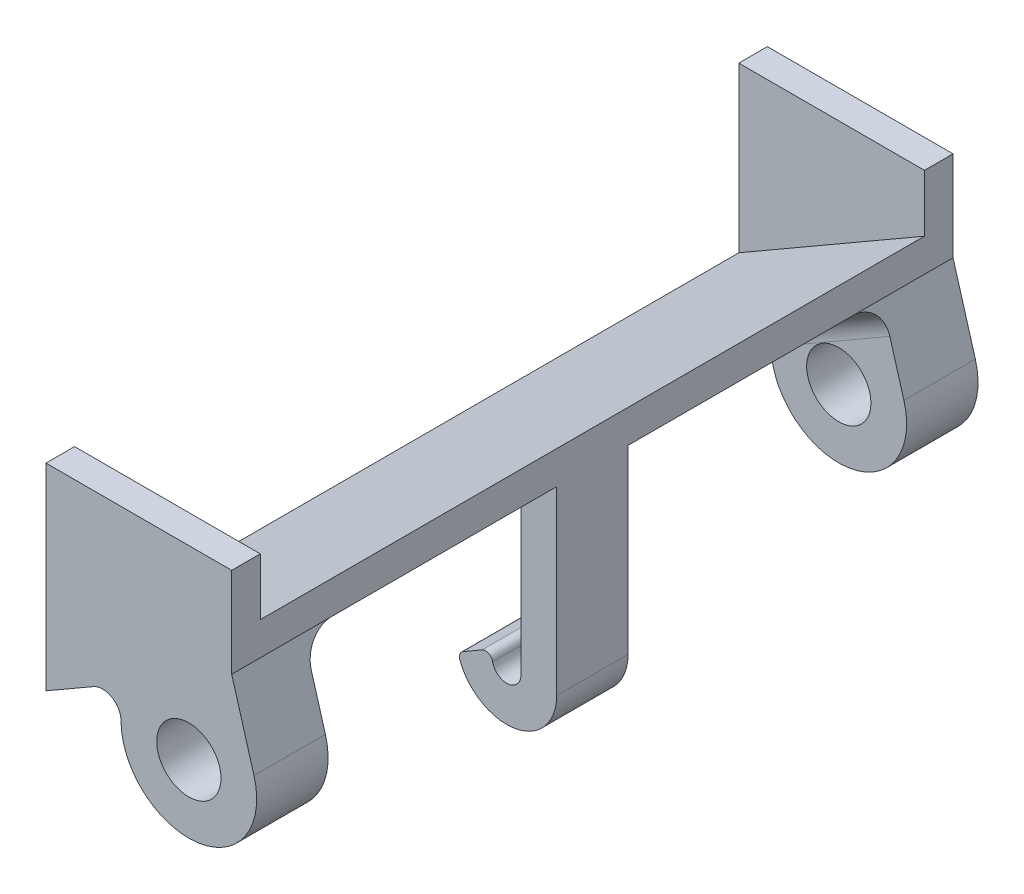
ISO-10303-21;
HEADER;
FILE_DESCRIPTION(('STEP AP214'),'2;1');
FILE_NAME('part.step','',(''),(''),'','','');
FILE_SCHEMA(('AUTOMOTIVE_DESIGN { 1 0 10303 214 1 1 1 1 }'));
ENDSEC;
DATA;
#1=APPLICATION_CONTEXT('core data for automotive mechanical design processes');
#2=APPLICATION_PROTOCOL_DEFINITION('international standard','automotive_design',2000,#1);
#3=PRODUCT_CONTEXT('',#1,'mechanical');
#4=PRODUCT('Part','Part','',(#3));
#5=PRODUCT_RELATED_PRODUCT_CATEGORY('part','',(#4));
#6=PRODUCT_DEFINITION_FORMATION('','',#4);
#7=PRODUCT_DEFINITION_CONTEXT('part definition',#1,'design');
#8=PRODUCT_DEFINITION('design','',#6,#7);
#9=PRODUCT_DEFINITION_SHAPE('','',#8);
#10=(LENGTH_UNIT() NAMED_UNIT(*) SI_UNIT(.MILLI.,.METRE.));
#11=(NAMED_UNIT(*) PLANE_ANGLE_UNIT() SI_UNIT($,.RADIAN.));
#12=(NAMED_UNIT(*) SI_UNIT($,.STERADIAN.) SOLID_ANGLE_UNIT());
#13=UNCERTAINTY_MEASURE_WITH_UNIT(LENGTH_MEASURE(1.E-05),#10,'distance_accuracy_value','');
#14=(GEOMETRIC_REPRESENTATION_CONTEXT(3) GLOBAL_UNCERTAINTY_ASSIGNED_CONTEXT((#13)) GLOBAL_UNIT_ASSIGNED_CONTEXT((#10,
#11,#12)) REPRESENTATION_CONTEXT('',''));
#15=CARTESIAN_POINT('',(0.,0.,0.));
#16=DIRECTION('',(0.,0.,1.));
#17=DIRECTION('',(1.,0.,0.));
#18=AXIS2_PLACEMENT_3D('',#15,#16,#17);
#19=CARTESIAN_POINT('',(0.,0.,-25.25));
#20=DIRECTION('',(-0.499999999999995,0.866025403784442,0.));
#21=DIRECTION('',(-0.866025403784442,-0.499999999999995,0.));
#22=AXIS2_PLACEMENT_3D('',#19,#20,#21);
#23=PLANE('',#22);
#24=DIRECTION('',(0.,0.,-1.));
#25=VECTOR('',#24,1.);
#26=CARTESIAN_POINT('',(10.5,6.06217782649097,2.5));
#27=LINE('',#26,#25);
#28=CARTESIAN_POINT('',(10.5,6.06217782649099,2.5));
#29=VERTEX_POINT('',#28);
#30=CARTESIAN_POINT('',(10.5,6.06217782649098,-2.5));
#31=VERTEX_POINT('',#30);
#32=EDGE_CURVE('E113',#29,#31,#27,.T.);
#33=ORIENTED_EDGE('',*,*,#32,.F.);
#34=DIRECTION('',(-0.866025403784439,-0.5,0.));
#35=VECTOR('',#34,1.);
#36=CARTESIAN_POINT('',(13.,7.50555349946503,2.5));
#37=LINE('',#36,#35);
#38=CARTESIAN_POINT('',(13.,7.50555349946503,2.5));
#39=VERTEX_POINT('',#38);
#40=EDGE_CURVE('E271',#39,#29,#37,.T.);
#41=ORIENTED_EDGE('',*,*,#40,.F.);
#42=DIRECTION('',(0.,0.,1.));
#43=VECTOR('',#42,1.);
#44=CARTESIAN_POINT('',(13.,7.50555349946503,-25.25));
#45=LINE('',#44,#43);
#46=CARTESIAN_POINT('',(13.,7.50555349946503,18.25));
#47=VERTEX_POINT('',#46);
#48=EDGE_CURVE('E476',#39,#47,#45,.T.);
#49=ORIENTED_EDGE('',*,*,#48,.T.);
#50=DIRECTION('',(0.866025403784442,0.499999999999995,0.));
#51=VECTOR('',#50,1.);
#52=CARTESIAN_POINT('',(3.32307815082795,1.91858006491866,18.25));
#53=LINE('',#52,#51);
#54=CARTESIAN_POINT('',(3.32307815082795,1.91858006491866,18.25));
#55=VERTEX_POINT('',#54);
#56=EDGE_CURVE('E515',#47,#55,#53,.F.);
#57=ORIENTED_EDGE('',*,*,#56,.T.);
#58=DIRECTION('',(0.,0.,1.));
#59=VECTOR('',#58,1.);
#60=CARTESIAN_POINT('',(3.32307815082795,1.91858006491866,20.25));
#61=LINE('',#60,#59);
#62=CARTESIAN_POINT('',(3.32307815082795,1.91858006491866,25.25));
#63=VERTEX_POINT('',#62);
#64=EDGE_CURVE('E417',#55,#63,#61,.T.);
#65=ORIENTED_EDGE('',*,*,#64,.T.);
#66=DIRECTION('',(-0.866025403784442,-0.499999999999995,0.));
#67=VECTOR('',#66,1.);
#68=CARTESIAN_POINT('',(0.,0.,25.25));
#69=LINE('',#68,#67);
#70=CARTESIAN_POINT('',(0.,0.,25.25));
#71=VERTEX_POINT('',#70);
#72=EDGE_CURVE('E440',#63,#71,#69,.T.);
#73=ORIENTED_EDGE('',*,*,#72,.T.);
#74=DIRECTION('',(0.,0.,1.));
#75=VECTOR('',#74,1.);
#76=CARTESIAN_POINT('',(0.,0.,-25.25));
#77=LINE('',#76,#75);
#78=CARTESIAN_POINT('',(0.,0.,-25.25));
#79=VERTEX_POINT('',#78);
#80=EDGE_CURVE('E489',#79,#71,#77,.T.);
#81=ORIENTED_EDGE('',*,*,#80,.F.);
#82=DIRECTION('',(-0.866025403784442,-0.499999999999995,0.));
#83=VECTOR('',#82,1.);
#84=CARTESIAN_POINT('',(0.,0.,-25.25));
#85=LINE('',#84,#83);
#86=CARTESIAN_POINT('',(3.32307815082795,1.91858006491865,-25.25));
#87=VERTEX_POINT('',#86);
#88=EDGE_CURVE('E463',#87,#79,#85,.T.);
#89=ORIENTED_EDGE('',*,*,#88,.F.);
#90=DIRECTION('',(0.,0.,-1.));
#91=VECTOR('',#90,1.);
#92=CARTESIAN_POINT('',(3.32307815082795,1.91858006491866,-20.25));
#93=LINE('',#92,#91);
#94=CARTESIAN_POINT('',(3.32307815082795,1.91858006491866,-18.25));
#95=VERTEX_POINT('',#94);
#96=EDGE_CURVE('E376',#95,#87,#93,.T.);
#97=ORIENTED_EDGE('',*,*,#96,.F.);
#98=DIRECTION('',(0.866025403784442,0.499999999999995,0.));
#99=VECTOR('',#98,1.);
#100=CARTESIAN_POINT('',(0.,0.,-18.25));
#101=LINE('',#100,#99);
#102=CARTESIAN_POINT('',(13.,7.50555349946503,-18.25));
#103=VERTEX_POINT('',#102);
#104=EDGE_CURVE('E511',#95,#103,#101,.T.);
#105=ORIENTED_EDGE('',*,*,#104,.T.);
#106=CARTESIAN_POINT('',(13.,7.50555349946503,-2.5));
#107=VERTEX_POINT('',#106);
#108=EDGE_CURVE('E507',#103,#107,#45,.T.);
#109=ORIENTED_EDGE('',*,*,#108,.T.);
#110=DIRECTION('',(-0.866025403784439,-0.5,0.));
#111=VECTOR('',#110,1.);
#112=CARTESIAN_POINT('',(13.,7.50555349946503,-2.5));
#113=LINE('',#112,#111);
#114=EDGE_CURVE('E118',#107,#31,#113,.T.);
#115=ORIENTED_EDGE('',*,*,#114,.T.);
#116=EDGE_LOOP('',(#33,#41,#49,#57,#65,#73,#81,#89,#97,#105,#109,#115));
#117=FACE_BOUND('',#116,.T.);
#118=ADVANCED_FACE('F91',(#117),#23,.F.);
#119=CARTESIAN_POINT('',(0.,0.,-25.25));
#120=DIRECTION('',(1.,0.,0.));
#121=DIRECTION('',(0.,0.,-1.));
#122=AXIS2_PLACEMENT_3D('',#119,#120,#121);
#123=PLANE('',#122);
#124=DIRECTION('',(0.,1.,0.));
#125=VECTOR('',#124,1.);
#126=CARTESIAN_POINT('',(0.,0.,23.25));
#127=LINE('',#126,#125);
#128=CARTESIAN_POINT('',(0.,2.3094010767585,23.25));
#129=VERTEX_POINT('',#128);
#130=CARTESIAN_POINT('',(0.,13.8080647707223,23.25));
#131=VERTEX_POINT('',#130);
#132=EDGE_CURVE('E435',#129,#131,#127,.T.);
#133=ORIENTED_EDGE('',*,*,#132,.F.);
#134=DIRECTION('',(0.,0.,1.));
#135=VECTOR('',#134,1.);
#136=CARTESIAN_POINT('',(0.,2.3094010767585,-25.25));
#137=LINE('',#136,#135);
#138=CARTESIAN_POINT('',(0.,2.3094010767585,-23.25));
#139=VERTEX_POINT('',#138);
#140=EDGE_CURVE('E436',#139,#129,#137,.T.);
#141=ORIENTED_EDGE('',*,*,#140,.F.);
#142=DIRECTION('',(0.,1.,0.));
#143=VECTOR('',#142,1.);
#144=CARTESIAN_POINT('',(0.,0.,-23.25));
#145=LINE('',#144,#143);
#146=CARTESIAN_POINT('',(0.,13.8080647707223,-23.25));
#147=VERTEX_POINT('',#146);
#148=EDGE_CURVE('E452',#139,#147,#145,.T.);
#149=ORIENTED_EDGE('',*,*,#148,.T.);
#150=DIRECTION('',(0.,0.,1.));
#151=VECTOR('',#150,1.);
#152=CARTESIAN_POINT('',(0.,13.8080647707223,-25.25));
#153=LINE('',#152,#151);
#154=CARTESIAN_POINT('',(0.,13.8080647707223,-25.25));
#155=VERTEX_POINT('',#154);
#156=EDGE_CURVE('E494',#155,#147,#153,.T.);
#157=ORIENTED_EDGE('',*,*,#156,.F.);
#158=DIRECTION('',(0.,1.,0.));
#159=VECTOR('',#158,1.);
#160=CARTESIAN_POINT('',(0.,0.,-25.25));
#161=LINE('',#160,#159);
#162=EDGE_CURVE('E473',#79,#155,#161,.T.);
#163=ORIENTED_EDGE('',*,*,#162,.F.);
#164=ORIENTED_EDGE('',*,*,#80,.T.);
#165=DIRECTION('',(0.,1.,0.));
#166=VECTOR('',#165,1.);
#167=CARTESIAN_POINT('',(0.,0.,25.25));
#168=LINE('',#167,#166);
#169=CARTESIAN_POINT('',(0.,13.8080647707223,25.25));
#170=VERTEX_POINT('',#169);
#171=EDGE_CURVE('E467',#71,#170,#168,.T.);
#172=ORIENTED_EDGE('',*,*,#171,.T.);
#173=EDGE_CURVE('E498',#131,#170,#153,.T.);
#174=ORIENTED_EDGE('',*,*,#173,.F.);
#175=EDGE_LOOP('',(#133,#141,#149,#157,#163,#164,#172,#174));
#176=FACE_BOUND('',#175,.T.);
#177=ADVANCED_FACE('F583',(#176),#123,.F.);
#178=CARTESIAN_POINT('',(0.,13.8080647707223,-25.25));
#179=DIRECTION('',(0.,-1.,0.));
#180=DIRECTION('',(0.,0.,-1.));
#181=AXIS2_PLACEMENT_3D('',#178,#179,#180);
#182=PLANE('',#181);
#183=DIRECTION('',(1.,0.,0.));
#184=VECTOR('',#183,1.);
#185=CARTESIAN_POINT('',(0.,13.8080647707223,23.25));
#186=LINE('',#185,#184);
#187=CARTESIAN_POINT('',(13.,13.8080647707223,23.25));
#188=VERTEX_POINT('',#187);
#189=EDGE_CURVE('E444',#131,#188,#186,.T.);
#190=ORIENTED_EDGE('',*,*,#189,.F.);
#191=ORIENTED_EDGE('',*,*,#173,.T.);
#192=DIRECTION('',(1.,0.,0.));
#193=VECTOR('',#192,1.);
#194=CARTESIAN_POINT('',(0.,13.8080647707223,25.25));
#195=LINE('',#194,#193);
#196=CARTESIAN_POINT('',(13.,13.8080647707223,25.25));
#197=VERTEX_POINT('',#196);
#198=EDGE_CURVE('E482',#170,#197,#195,.T.);
#199=ORIENTED_EDGE('',*,*,#198,.T.);
#200=DIRECTION('',(0.,0.,1.));
#201=VECTOR('',#200,1.);
#202=CARTESIAN_POINT('',(13.,13.8080647707223,-25.25));
#203=LINE('',#202,#201);
#204=EDGE_CURVE('E503',#188,#197,#203,.T.);
#205=ORIENTED_EDGE('',*,*,#204,.F.);
#206=EDGE_LOOP('',(#190,#191,#199,#205));
#207=FACE_BOUND('',#206,.T.);
#208=ADVANCED_FACE('F586',(#207),#182,.F.);
#209=CARTESIAN_POINT('',(13.,0.,-25.25));
#210=DIRECTION('',(-1.,0.,0.));
#211=DIRECTION('',(0.,0.,1.));
#212=AXIS2_PLACEMENT_3D('',#209,#210,#211);
#213=PLANE('',#212);
#214=ORIENTED_EDGE('',*,*,#108,.F.);
#215=CARTESIAN_POINT('',(13.,7.50555349946503,-25.25));
#216=VERTEX_POINT('',#215);
#217=EDGE_CURVE('E504',#216,#103,#45,.T.);
#218=ORIENTED_EDGE('',*,*,#217,.F.);
#219=DIRECTION('',(0.,-1.,0.));
#220=VECTOR('',#219,1.);
#221=CARTESIAN_POINT('',(13.,0.,-25.25));
#222=LINE('',#221,#220);
#223=CARTESIAN_POINT('',(13.,13.8080647707223,-25.25));
#224=VERTEX_POINT('',#223);
#225=EDGE_CURVE('E466',#224,#216,#222,.T.);
#226=ORIENTED_EDGE('',*,*,#225,.F.);
#227=CARTESIAN_POINT('',(13.,13.8080647707223,-23.25));
#228=VERTEX_POINT('',#227);
#229=EDGE_CURVE('E499',#224,#228,#203,.T.);
#230=ORIENTED_EDGE('',*,*,#229,.T.);
#231=DIRECTION('',(0.,-1.,0.));
#232=VECTOR('',#231,1.);
#233=CARTESIAN_POINT('',(13.,0.,-23.25));
#234=LINE('',#233,#232);
#235=CARTESIAN_POINT('',(13.,9.81495457622353,-23.25));
#236=VERTEX_POINT('',#235);
#237=EDGE_CURVE('E434',#228,#236,#234,.T.);
#238=ORIENTED_EDGE('',*,*,#237,.T.);
#239=DIRECTION('',(0.,0.,1.));
#240=VECTOR('',#239,1.);
#241=CARTESIAN_POINT('',(13.,9.81495457622353,-25.25));
#242=LINE('',#241,#240);
#243=CARTESIAN_POINT('',(13.,9.81495457622353,23.25));
#244=VERTEX_POINT('',#243);
#245=EDGE_CURVE('E441',#236,#244,#242,.T.);
#246=ORIENTED_EDGE('',*,*,#245,.T.);
#247=DIRECTION('',(0.,-1.,0.));
#248=VECTOR('',#247,1.);
#249=CARTESIAN_POINT('',(13.,0.,23.25));
#250=LINE('',#249,#248);
#251=EDGE_CURVE('E430',#188,#244,#250,.T.);
#252=ORIENTED_EDGE('',*,*,#251,.F.);
#253=ORIENTED_EDGE('',*,*,#204,.T.);
#254=DIRECTION('',(0.,-1.,0.));
#255=VECTOR('',#254,1.);
#256=CARTESIAN_POINT('',(13.,0.,25.25));
#257=LINE('',#256,#255);
#258=CARTESIAN_POINT('',(13.,7.50555349946503,25.25));
#259=VERTEX_POINT('',#258);
#260=EDGE_CURVE('E479',#197,#259,#257,.T.);
#261=ORIENTED_EDGE('',*,*,#260,.T.);
#262=DIRECTION('',(0.,0.,1.));
#263=VECTOR('',#262,1.);
#264=CARTESIAN_POINT('',(13.,7.50555349946503,20.25));
#265=LINE('',#264,#263);
#266=EDGE_CURVE('E403',#47,#259,#265,.T.);
#267=ORIENTED_EDGE('',*,*,#266,.F.);
#268=ORIENTED_EDGE('',*,*,#48,.F.);
#269=DIRECTION('',(0.,1.,0.));
#270=VECTOR('',#269,1.);
#271=CARTESIAN_POINT('',(13.,7.50555349946503,2.5));
#272=LINE('',#271,#270);
#273=CARTESIAN_POINT('',(13.,-5.16417579532717,2.5));
#274=VERTEX_POINT('',#273);
#275=EDGE_CURVE('E303',#274,#39,#272,.T.);
#276=ORIENTED_EDGE('',*,*,#275,.F.);
#277=DIRECTION('',(0.,0.,-1.));
#278=VECTOR('',#277,1.);
#279=CARTESIAN_POINT('',(13.,-5.16417579532717,2.5));
#280=LINE('',#279,#278);
#281=CARTESIAN_POINT('',(13.,-5.16417579532717,-2.5));
#282=VERTEX_POINT('',#281);
#283=EDGE_CURVE('E306',#274,#282,#280,.T.);
#284=ORIENTED_EDGE('',*,*,#283,.T.);
#285=DIRECTION('',(0.,1.,0.));
#286=VECTOR('',#285,1.);
#287=CARTESIAN_POINT('',(13.,7.50555349946503,-2.5));
#288=LINE('',#287,#286);
#289=EDGE_CURVE('E326',#282,#107,#288,.T.);
#290=ORIENTED_EDGE('',*,*,#289,.T.);
#291=EDGE_LOOP('',(#214,#218,#226,#230,#238,#246,#252,#253,#261,#267,#268,#276,#284,#290));
#292=FACE_BOUND('',#291,.T.);
#293=ADVANCED_FACE('F590',(#292),#213,.F.);
#294=ORIENTED_EDGE('',*,*,#156,.T.);
#295=DIRECTION('',(1.,0.,0.));
#296=VECTOR('',#295,1.);
#297=CARTESIAN_POINT('',(0.,13.8080647707223,-23.25));
#298=LINE('',#297,#296);
#299=EDGE_CURVE('E456',#147,#228,#298,.T.);
#300=ORIENTED_EDGE('',*,*,#299,.T.);
#301=ORIENTED_EDGE('',*,*,#229,.F.);
#302=DIRECTION('',(1.,0.,0.));
#303=VECTOR('',#302,1.);
#304=CARTESIAN_POINT('',(0.,13.8080647707223,-25.25));
#305=LINE('',#304,#303);
#306=EDGE_CURVE('E470',#155,#224,#305,.T.);
#307=ORIENTED_EDGE('',*,*,#306,.F.);
#308=EDGE_LOOP('',(#294,#300,#301,#307));
#309=FACE_BOUND('',#308,.T.);
#310=ADVANCED_FACE('F578',(#309),#182,.F.);
#311=CARTESIAN_POINT('',(0.,0.,-25.25));
#312=DIRECTION('',(0.,0.,1.));
#313=DIRECTION('',(1.,0.,0.));
#314=AXIS2_PLACEMENT_3D('',#311,#312,#313);
#315=PLANE('',#314);
#316=ORIENTED_EDGE('',*,*,#225,.T.);
#317=DIRECTION('',(-0.279421017454678,0.960168680495564,0.));
#318=VECTOR('',#317,1.);
#319=CARTESIAN_POINT('',(13.9986854129456,4.07379140829129,-25.25));
#320=LINE('',#319,#318);
#321=CARTESIAN_POINT('',(14.5608012323539,2.14220440913325,-25.25));
#322=VERTEX_POINT('',#321);
#323=EDGE_CURVE('E354',#322,#216,#320,.T.);
#324=ORIENTED_EDGE('',*,*,#323,.F.);
#325=CARTESIAN_POINT('',(10.,0.814954576223529,-25.25));
#326=DIRECTION('',(0.,0.,1.));
#327=DIRECTION('',(1.,0.,0.));
#328=AXIS2_PLACEMENT_3D('',#325,#326,#327);
#329=CIRCLE('',#328,4.75);
#330=CARTESIAN_POINT('',(5.25000515095764,0.807959287019187,-25.25));
#331=VERTEX_POINT('',#330);
#332=EDGE_CURVE('E370',#331,#322,#329,.T.);
#333=ORIENTED_EDGE('',*,*,#332,.F.);
#334=CARTESIAN_POINT('',(3.96538761522329,0.806067438403545,-25.25));
#335=DIRECTION('',(0.,0.,1.));
#336=DIRECTION('',(1.,0.,0.));
#337=AXIS2_PLACEMENT_3D('',#334,#335,#336);
#338=CIRCLE('',#337,1.2846189287907);
#339=EDGE_CURVE('E363',#331,#87,#338,.T.);
#340=ORIENTED_EDGE('',*,*,#339,.T.);
#341=ORIENTED_EDGE('',*,*,#88,.T.);
#342=ORIENTED_EDGE('',*,*,#162,.T.);
#343=ORIENTED_EDGE('',*,*,#306,.T.);
#344=EDGE_LOOP('',(#316,#324,#333,#340,#341,#342,#343));
#345=FACE_BOUND('',#344,.T.);
#346=CARTESIAN_POINT('',(10.,0.814954576223529,-25.25));
#347=DIRECTION('',(0.,0.,1.));
#348=DIRECTION('',(1.,0.,0.));
#349=AXIS2_PLACEMENT_3D('',#346,#347,#348);
#350=CIRCLE('',#349,2.25);
#351=CARTESIAN_POINT('',(12.25,0.814954576223529,-25.25));
#352=VERTEX_POINT('',#351);
#353=EDGE_CURVE('E349',#352,#352,#350,.T.);
#354=ORIENTED_EDGE('',*,*,#353,.T.);
#355=EDGE_LOOP('',(#354));
#356=FACE_BOUND('',#355,.T.);
#357=ADVANCED_FACE('F575',(#345,#356),#315,.F.);
#358=CARTESIAN_POINT('',(0.,0.,25.25));
#359=DIRECTION('',(0.,0.,1.));
#360=DIRECTION('',(1.,0.,0.));
#361=AXIS2_PLACEMENT_3D('',#358,#359,#360);
#362=PLANE('',#361);
#363=ORIENTED_EDGE('',*,*,#72,.F.);
#364=CARTESIAN_POINT('',(3.96538761522329,0.806067438403545,25.25));
#365=DIRECTION('',(0.,0.,1.));
#366=DIRECTION('',(1.,0.,0.));
#367=AXIS2_PLACEMENT_3D('',#364,#365,#366);
#368=CIRCLE('',#367,1.2846189287907);
#369=CARTESIAN_POINT('',(5.25000515095764,0.807959287019187,25.25));
#370=VERTEX_POINT('',#369);
#371=EDGE_CURVE('E400',#370,#63,#368,.T.);
#372=ORIENTED_EDGE('',*,*,#371,.F.);
#373=CARTESIAN_POINT('',(10.,0.814954576223529,25.25));
#374=DIRECTION('',(0.,0.,1.));
#375=DIRECTION('',(1.,0.,0.));
#376=AXIS2_PLACEMENT_3D('',#373,#374,#375);
#377=CIRCLE('',#376,4.75);
#378=CARTESIAN_POINT('',(14.5608012323539,2.14220440913325,25.25));
#379=VERTEX_POINT('',#378);
#380=EDGE_CURVE('E407',#370,#379,#377,.T.);
#381=ORIENTED_EDGE('',*,*,#380,.T.);
#382=DIRECTION('',(0.279421017454678,-0.960168680495564,0.));
#383=VECTOR('',#382,1.);
#384=CARTESIAN_POINT('',(13.9986854129456,4.07379140829129,25.25));
#385=LINE('',#384,#383);
#386=EDGE_CURVE('E391',#259,#379,#385,.T.);
#387=ORIENTED_EDGE('',*,*,#386,.F.);
#388=ORIENTED_EDGE('',*,*,#260,.F.);
#389=ORIENTED_EDGE('',*,*,#198,.F.);
#390=ORIENTED_EDGE('',*,*,#171,.F.);
#391=EDGE_LOOP('',(#363,#372,#381,#387,#388,#389,#390));
#392=FACE_BOUND('',#391,.T.);
#393=CARTESIAN_POINT('',(10.,0.814954576223529,25.25));
#394=DIRECTION('',(0.,0.,1.));
#395=DIRECTION('',(1.,0.,0.));
#396=AXIS2_PLACEMENT_3D('',#393,#394,#395);
#397=CIRCLE('',#396,2.25);
#398=CARTESIAN_POINT('',(12.25,0.814954576223529,25.25));
#399=VERTEX_POINT('',#398);
#400=EDGE_CURVE('E380',#399,#399,#397,.T.);
#401=ORIENTED_EDGE('',*,*,#400,.F.);
#402=EDGE_LOOP('',(#401));
#403=FACE_BOUND('',#402,.T.);
#404=ADVANCED_FACE('F566',(#392,#403),#362,.T.);
#405=CARTESIAN_POINT('',(-0.99999999999999,1.73205080756888,-25.25));
#406=DIRECTION('',(-0.499999999999995,0.866025403784442,0.));
#407=DIRECTION('',(-0.866025403784442,-0.499999999999995,0.));
#408=AXIS2_PLACEMENT_3D('',#405,#406,#407);
#409=PLANE('',#408);
#410=DIRECTION('',(-0.866025403784442,-0.499999999999995,0.));
#411=VECTOR('',#410,1.);
#412=CARTESIAN_POINT('',(-0.99999999999999,1.73205080756888,23.25));
#413=LINE('',#412,#411);
#414=EDGE_CURVE('E427',#244,#129,#413,.T.);
#415=ORIENTED_EDGE('',*,*,#414,.F.);
#416=ORIENTED_EDGE('',*,*,#245,.F.);
#417=DIRECTION('',(-0.866025403784442,-0.499999999999995,0.));
#418=VECTOR('',#417,1.);
#419=CARTESIAN_POINT('',(-0.99999999999999,1.73205080756888,-23.25));
#420=LINE('',#419,#418);
#421=EDGE_CURVE('E431',#236,#139,#420,.T.);
#422=ORIENTED_EDGE('',*,*,#421,.T.);
#423=ORIENTED_EDGE('',*,*,#140,.T.);
#424=EDGE_LOOP('',(#415,#416,#422,#423));
#425=FACE_BOUND('',#424,.T.);
#426=ADVANCED_FACE('F562',(#425),#409,.T.);
#427=CARTESIAN_POINT('',(0.,0.,-23.25));
#428=DIRECTION('',(0.,0.,1.));
#429=DIRECTION('',(1.,0.,0.));
#430=AXIS2_PLACEMENT_3D('',#427,#428,#429);
#431=PLANE('',#430);
#432=ORIENTED_EDGE('',*,*,#421,.F.);
#433=ORIENTED_EDGE('',*,*,#237,.F.);
#434=ORIENTED_EDGE('',*,*,#299,.F.);
#435=ORIENTED_EDGE('',*,*,#148,.F.);
#436=EDGE_LOOP('',(#432,#433,#434,#435));
#437=FACE_BOUND('',#436,.T.);
#438=ADVANCED_FACE('F565',(#437),#431,.T.);
#439=CARTESIAN_POINT('',(0.,0.,23.25));
#440=DIRECTION('',(0.,0.,1.));
#441=DIRECTION('',(1.,0.,0.));
#442=AXIS2_PLACEMENT_3D('',#439,#440,#441);
#443=PLANE('',#442);
#444=ORIENTED_EDGE('',*,*,#414,.T.);
#445=ORIENTED_EDGE('',*,*,#132,.T.);
#446=ORIENTED_EDGE('',*,*,#189,.T.);
#447=ORIENTED_EDGE('',*,*,#251,.T.);
#448=EDGE_LOOP('',(#444,#445,#446,#447));
#449=FACE_BOUND('',#448,.T.);
#450=ADVANCED_FACE('F570',(#449),#443,.F.);
#451=CARTESIAN_POINT('',(10.,0.814954576223529,20.25));
#452=DIRECTION('',(0.,0.,1.));
#453=DIRECTION('',(1.,0.,0.));
#454=AXIS2_PLACEMENT_3D('',#451,#452,#453);
#455=PLANE('',#454);
#456=CARTESIAN_POINT('',(10.,0.814954576223529,20.25));
#457=DIRECTION('',(0.,0.,1.));
#458=DIRECTION('',(1.,0.,0.));
#459=AXIS2_PLACEMENT_3D('',#456,#457,#458);
#460=CIRCLE('',#459,2.25);
#461=CARTESIAN_POINT('',(12.25,0.814954576223529,20.25));
#462=VERTEX_POINT('',#461);
#463=EDGE_CURVE('E387',#462,#462,#460,.T.);
#464=ORIENTED_EDGE('',*,*,#463,.T.);
#465=EDGE_LOOP('',(#464));
#466=FACE_BOUND('',#465,.T.);
#467=CARTESIAN_POINT('',(10.,0.814954576223529,20.25));
#468=DIRECTION('',(0.,0.,1.));
#469=DIRECTION('',(1.,0.,0.));
#470=AXIS2_PLACEMENT_3D('',#467,#468,#469);
#471=CIRCLE('',#470,4.75);
#472=CARTESIAN_POINT('',(5.25090550104307,0.72221062775797,20.25));
#473=VERTEX_POINT('',#472);
#474=CARTESIAN_POINT('',(14.5608012323539,2.14220440913325,20.25));
#475=VERTEX_POINT('',#474);
#476=EDGE_CURVE('E399',#473,#475,#471,.T.);
#477=ORIENTED_EDGE('',*,*,#476,.F.);
#478=DIRECTION('',(0.866025403784442,0.499999999999995,0.));
#479=VECTOR('',#478,1.);
#480=CARTESIAN_POINT('',(14.,5.77350269189615,20.25));
#481=LINE('',#480,#479);
#482=CARTESIAN_POINT('',(13.5753896793834,5.52835380898747,20.25));
#483=VERTEX_POINT('',#482);
#484=EDGE_CURVE('E493',#473,#483,#481,.T.);
#485=ORIENTED_EDGE('',*,*,#484,.T.);
#486=DIRECTION('',(0.279421017454678,-0.960168680495564,0.));
#487=VECTOR('',#486,1.);
#488=CARTESIAN_POINT('',(13.9986854129456,4.07379140829129,20.25));
#489=LINE('',#488,#487);
#490=EDGE_CURVE('E395',#483,#475,#489,.T.);
#491=ORIENTED_EDGE('',*,*,#490,.T.);
#492=EDGE_LOOP('',(#477,#485,#491));
#493=FACE_BOUND('',#492,.T.);
#494=ADVANCED_FACE('F552',(#466,#493),#455,.F.);
#495=CARTESIAN_POINT('',(13.9986854129456,4.07379140829129,20.25));
#496=DIRECTION('',(-0.960168680495564,-0.279421017454678,0.));
#497=DIRECTION('',(0.279421017454678,-0.960168680495564,0.));
#498=AXIS2_PLACEMENT_3D('',#495,#496,#497);
#499=PLANE('',#498);
#500=ORIENTED_EDGE('',*,*,#386,.T.);
#501=DIRECTION('',(0.,0.,1.));
#502=VECTOR('',#501,1.);
#503=CARTESIAN_POINT('',(14.5608012323539,2.14220440913325,20.25));
#504=LINE('',#503,#502);
#505=EDGE_CURVE('E424',#475,#379,#504,.T.);
#506=ORIENTED_EDGE('',*,*,#505,.F.);
#507=ORIENTED_EDGE('',*,*,#490,.F.);
#508=CARTESIAN_POINT('',(13.5753896793834,5.52835380898747,18.25));
#509=DIRECTION('',(-0.960168680495564,-0.279421017454678,0.));
#510=DIRECTION('',(0.279421017454678,-0.960168680495564,0.));
#511=AXIS2_PLACEMENT_3D('',#508,#509,#510);
#512=ELLIPSE('',#511,2.05922118752831,2.);
#513=EDGE_CURVE('E522',#483,#47,#512,.T.);
#514=ORIENTED_EDGE('',*,*,#513,.T.);
#515=ORIENTED_EDGE('',*,*,#266,.T.);
#516=EDGE_LOOP('',(#500,#506,#507,#514,#515));
#517=FACE_BOUND('',#516,.T.);
#518=ADVANCED_FACE('F557',(#517),#499,.F.);
#519=CARTESIAN_POINT('',(10.,0.814954576223529,20.25));
#520=DIRECTION('',(0.,0.,1.));
#521=DIRECTION('',(1.,0.,0.));
#522=AXIS2_PLACEMENT_3D('',#519,#520,#521);
#523=CYLINDRICAL_SURFACE('',#522,4.75);
#524=ORIENTED_EDGE('',*,*,#380,.F.);
#525=DIRECTION('',(0.,0.,1.));
#526=VECTOR('',#525,1.);
#527=CARTESIAN_POINT('',(5.25000515095764,0.807959287019187,20.25));
#528=LINE('',#527,#526);
#529=CARTESIAN_POINT('',(5.25000515095764,0.807959287019187,20.2486040909734));
#530=VERTEX_POINT('',#529);
#531=EDGE_CURVE('E421',#530,#370,#528,.T.);
#532=ORIENTED_EDGE('',*,*,#531,.F.);
#533=CARTESIAN_POINT('',(5.25000515095765,0.807959287019187,20.2486040909734));
#534=CARTESIAN_POINT('',(5.25002616294659,0.793670256897037,20.2490682088282));
#535=CARTESIAN_POINT('',(5.25011169811485,0.779380020230846,20.2494165935077));
#536=CARTESIAN_POINT('',(5.25041181480999,0.750797133810441,20.2498818965166));
#537=CARTESIAN_POINT('',(5.25062639633688,0.736504484056226,20.2499988148459));
#538=CARTESIAN_POINT('',(5.25090550104307,0.72221062775797,20.25));
#539=B_SPLINE_CURVE_WITH_KNOTS('',3,(#533,#534,#535,#536,#537,#538),.UNSPECIFIED.,.F.,.F.,(4,2,
4),(0.,0.0428842158507258,0.0857684317012743),.UNSPECIFIED.);
#540=EDGE_CURVE('E535',#530,#473,#539,.T.);
#541=ORIENTED_EDGE('',*,*,#540,.T.);
#542=ORIENTED_EDGE('',*,*,#476,.T.);
#543=ORIENTED_EDGE('',*,*,#505,.T.);
#544=EDGE_LOOP('',(#524,#532,#541,#542,#543));
#545=FACE_BOUND('',#544,.T.);
#546=ADVANCED_FACE('F550',(#545),#523,.T.);
#547=CARTESIAN_POINT('',(3.96538761522329,0.806067438403545,20.25));
#548=DIRECTION('',(0.,0.,1.));
#549=DIRECTION('',(1.,0.,0.));
#550=AXIS2_PLACEMENT_3D('',#547,#548,#549);
#551=CYLINDRICAL_SURFACE('',#550,1.2846189287907);
#552=ORIENTED_EDGE('',*,*,#371,.T.);
#553=ORIENTED_EDGE('',*,*,#64,.F.);
#554=CARTESIAN_POINT('',(5.25000515095765,0.807959287019187,20.2486040909734));
#555=CARTESIAN_POINT('',(5.24995997158441,0.839676509640055,20.2475779878041));
#556=CARTESIAN_POINT('',(5.24873602054636,0.871361142291051,20.2459589607587));
#557=CARTESIAN_POINT('',(5.24396574642969,0.934463151822254,20.2414172558714));
#558=CARTESIAN_POINT('',(5.24041921925657,0.965880504969695,20.2384944634694));
#559=CARTESIAN_POINT('',(5.22638776462525,1.05916150638805,20.2276242480127));
#560=CARTESIAN_POINT('',(5.21250992536972,1.12032054886,20.2175683791626));
#561=CARTESIAN_POINT('',(5.17650590383956,1.23883263522395,20.1913847097182));
#562=CARTESIAN_POINT('',(5.15436954636612,1.29618088077172,20.1752494185127));
#563=CARTESIAN_POINT('',(5.10316461390066,1.40553008399749,20.1370359289741));
#564=CARTESIAN_POINT('',(5.07409569438766,1.45753077573932,20.1149574352803));
#565=CARTESIAN_POINT('',(5.01008286259928,1.55597420185345,20.0650388020433));
#566=CARTESIAN_POINT('',(4.97505717057742,1.60232158861338,20.0371170063369));
#567=CARTESIAN_POINT('',(4.90098503260898,1.68818141954713,19.9765192600771));
#568=CARTESIAN_POINT('',(4.86193529033069,1.72768818803046,19.9438394027278));
#569=CARTESIAN_POINT('',(4.76138741487043,1.81757045819978,19.8576050592745));
#570=CARTESIAN_POINT('',(4.69824633269179,1.86381969354055,19.8016549966415));
#571=CARTESIAN_POINT('',(4.56928045786006,1.9424160289825,19.6834607260847));
#572=CARTESIAN_POINT('',(4.50345032464992,1.97473382843937,19.6212035892369));
#573=CARTESIAN_POINT('',(4.34512177074925,2.03728119156176,19.466707936138));
#574=CARTESIAN_POINT('',(4.2523757783384,2.06162690256021,19.3723520103303));
#575=CARTESIAN_POINT('',(4.06941262156531,2.08981731370063,19.1782962014571));
#576=CARTESIAN_POINT('',(3.97920065768543,2.09362253907079,19.0785864002439));
#577=CARTESIAN_POINT('',(3.78940461983218,2.08266590150117,18.8598077543971));
#578=CARTESIAN_POINT('',(3.69063601998546,2.06483022956938,18.7401976321285));
#579=CARTESIAN_POINT('',(3.50203953295793,2.00823783144708,18.4993319099377));
#580=CARTESIAN_POINT('',(3.41219197374219,1.96952840498976,18.378080632124));
#581=CARTESIAN_POINT('',(3.32630959809194,1.92044104521355,18.2546528705319));
#582=CARTESIAN_POINT('',(3.32469283960028,1.91951229593051,18.2523264036624));
#583=CARTESIAN_POINT('',(3.32307815082795,1.91858006491865,18.25));
#584=B_SPLINE_CURVE_WITH_KNOTS('',3,(#554,#555,#556,#557,#558,#559,#560,#561,#562,#563,#564,
#565,#566,#567,#568,#569,#570,#571,#572,#573,#574,#575,#576,#577,#578,#579,#580,#581,#582,#583),
.UNSPECIFIED.,.F.,.F.,(4,2,2,2,2,2,2,2,2,2,2,2,2,2,4),(0.,0.0951488368717855,0.190306035992904,
0.379831248333295,0.569590747245138,0.759359678420817,0.951982555635595,1.14476449492795,
1.431776378197,1.7193889951254,2.12078149250088,2.52294511336334,2.98956997992309,
3.45514189505742,3.46408617525787),.UNSPECIFIED.);
#585=EDGE_CURVE('E526',#55,#530,#584,.F.);
#586=ORIENTED_EDGE('',*,*,#585,.T.);
#587=ORIENTED_EDGE('',*,*,#531,.T.);
#588=EDGE_LOOP('',(#552,#553,#586,#587));
#589=FACE_BOUND('',#588,.T.);
#590=ADVANCED_FACE('F545',(#589),#551,.F.);
#591=CARTESIAN_POINT('',(10.,0.814954576223529,20.25));
#592=DIRECTION('',(0.,0.,1.));
#593=DIRECTION('',(1.,0.,0.));
#594=AXIS2_PLACEMENT_3D('',#591,#592,#593);
#595=CYLINDRICAL_SURFACE('',#594,2.25);
#596=ORIENTED_EDGE('',*,*,#463,.F.);
#597=EDGE_LOOP('',(#596));
#598=FACE_BOUND('',#597,.T.);
#599=ORIENTED_EDGE('',*,*,#400,.T.);
#600=EDGE_LOOP('',(#599));
#601=FACE_BOUND('',#600,.T.);
#602=ADVANCED_FACE('F549',(#598,#601),#595,.F.);
#603=CARTESIAN_POINT('',(10.,0.814954576223529,-20.25));
#604=DIRECTION('',(0.,0.,1.));
#605=DIRECTION('',(1.,0.,0.));
#606=AXIS2_PLACEMENT_3D('',#603,#604,#605);
#607=PLANE('',#606);
#608=CARTESIAN_POINT('',(10.,0.814954576223529,-20.25));
#609=DIRECTION('',(0.,0.,1.));
#610=DIRECTION('',(1.,0.,0.));
#611=AXIS2_PLACEMENT_3D('',#608,#609,#610);
#612=CIRCLE('',#611,2.25);
#613=CARTESIAN_POINT('',(12.25,0.814954576223529,-20.25));
#614=VERTEX_POINT('',#613);
#615=EDGE_CURVE('E350',#614,#614,#612,.T.);
#616=ORIENTED_EDGE('',*,*,#615,.F.);
#617=EDGE_LOOP('',(#616));
#618=FACE_BOUND('',#617,.T.);
#619=DIRECTION('',(-0.279421017454678,0.960168680495564,0.));
#620=VECTOR('',#619,1.);
#621=CARTESIAN_POINT('',(13.9986854129456,4.07379140829129,-20.25));
#622=LINE('',#621,#620);
#623=CARTESIAN_POINT('',(14.5608012323539,2.14220440913325,-20.25));
#624=VERTEX_POINT('',#623);
#625=CARTESIAN_POINT('',(13.5753896793834,5.52835380898747,-20.25));
#626=VERTEX_POINT('',#625);
#627=EDGE_CURVE('E358',#624,#626,#622,.T.);
#628=ORIENTED_EDGE('',*,*,#627,.T.);
#629=DIRECTION('',(0.866025403784442,0.499999999999995,0.));
#630=VECTOR('',#629,1.);
#631=CARTESIAN_POINT('',(8.85288568297002,2.80181485540916,-20.25));
#632=LINE('',#631,#630);
#633=CARTESIAN_POINT('',(5.25090550104307,0.722210627757969,-20.25));
#634=VERTEX_POINT('',#633);
#635=EDGE_CURVE('E519',#626,#634,#632,.F.);
#636=ORIENTED_EDGE('',*,*,#635,.T.);
#637=CARTESIAN_POINT('',(10.,0.814954576223529,-20.25));
#638=DIRECTION('',(0.,0.,1.));
#639=DIRECTION('',(1.,0.,0.));
#640=AXIS2_PLACEMENT_3D('',#637,#638,#639);
#641=CIRCLE('',#640,4.75);
#642=EDGE_CURVE('E362',#634,#624,#641,.T.);
#643=ORIENTED_EDGE('',*,*,#642,.T.);
#644=EDGE_LOOP('',(#628,#636,#643));
#645=FACE_BOUND('',#644,.T.);
#646=ADVANCED_FACE('F734',(#618,#645),#607,.T.);
#647=CARTESIAN_POINT('',(3.96538761522329,0.806067438403545,-20.25));
#648=DIRECTION('',(0.,0.,-1.));
#649=DIRECTION('',(-1.,0.,0.));
#650=AXIS2_PLACEMENT_3D('',#647,#648,#649);
#651=CYLINDRICAL_SURFACE('',#650,1.2846189287907);
#652=ORIENTED_EDGE('',*,*,#339,.F.);
#653=DIRECTION('',(0.,0.,-1.));
#654=VECTOR('',#653,1.);
#655=CARTESIAN_POINT('',(5.25000515095764,0.807959287019187,-20.25));
#656=LINE('',#655,#654);
#657=CARTESIAN_POINT('',(5.25000515095764,0.807959287019187,-20.2486040909734));
#658=VERTEX_POINT('',#657);
#659=EDGE_CURVE('E381',#658,#331,#656,.T.);
#660=ORIENTED_EDGE('',*,*,#659,.F.);
#661=CARTESIAN_POINT('',(5.25000515095765,0.807959287019187,-20.2486040909734));
#662=CARTESIAN_POINT('',(5.24995997158441,0.839676509640055,-20.2475779878041));
#663=CARTESIAN_POINT('',(5.24873602054636,0.87136114229105,-20.2459589607587));
#664=CARTESIAN_POINT('',(5.24396574642969,0.934463151822252,-20.2414172558714));
#665=CARTESIAN_POINT('',(5.24041921925657,0.965880504969693,-20.2384944634694));
#666=CARTESIAN_POINT('',(5.22638776462525,1.05916150638805,-20.2276242480127));
#667=CARTESIAN_POINT('',(5.21250992536972,1.12032054886,-20.2175683791626));
#668=CARTESIAN_POINT('',(5.17650590383956,1.23883263522395,-20.1913847097182));
#669=CARTESIAN_POINT('',(5.15436954636612,1.29618088077172,-20.1752494185127));
#670=CARTESIAN_POINT('',(5.10316461390066,1.40553008399749,-20.1370359289741));
#671=CARTESIAN_POINT('',(5.07409569438766,1.45753077573932,-20.1149574352803));
#672=CARTESIAN_POINT('',(5.01008286259928,1.55597420185345,-20.0650388020433));
#673=CARTESIAN_POINT('',(4.97505717057742,1.60232158861338,-20.0371170063369));
#674=CARTESIAN_POINT('',(4.90098503260898,1.68818141954713,-19.9765192600771));
#675=CARTESIAN_POINT('',(4.86193529033069,1.72768818803046,-19.9438394027278));
#676=CARTESIAN_POINT('',(4.76138741487043,1.81757045819978,-19.8576050592745));
#677=CARTESIAN_POINT('',(4.69824633269178,1.86381969354055,-19.8016549966415));
#678=CARTESIAN_POINT('',(4.56928045786006,1.9424160289825,-19.6834607260847));
#679=CARTESIAN_POINT('',(4.50345032464993,1.97473382843937,-19.6212035892369));
#680=CARTESIAN_POINT('',(4.34512177074924,2.03728119156175,-19.466707936138));
#681=CARTESIAN_POINT('',(4.25237577833837,2.06162690256019,-19.3723520103303));
#682=CARTESIAN_POINT('',(4.06941262156536,2.08981731370065,-19.1782962014571));
#683=CARTESIAN_POINT('',(3.97920065768557,2.09362253907087,-19.0785864002438));
#684=CARTESIAN_POINT('',(3.78940461983201,2.08266590150108,-18.8598077543972));
#685=CARTESIAN_POINT('',(3.69063601998481,2.06483022956901,-18.7401976321291));
#686=CARTESIAN_POINT('',(3.50203953295857,2.00823783144746,-18.4993319099371));
#687=CARTESIAN_POINT('',(3.41219197374459,1.96952840499117,-18.3780806321217));
#688=CARTESIAN_POINT('',(3.32630959809203,1.92044104521361,-18.2546528705318));
#689=CARTESIAN_POINT('',(3.32469283960033,1.91951229593053,-18.2523264036623));
#690=CARTESIAN_POINT('',(3.32307815082795,1.91858006491865,-18.25));
#691=B_SPLINE_CURVE_WITH_KNOTS('',3,(#661,#662,#663,#664,#665,#666,#667,#668,#669,#670,#671,
#672,#673,#674,#675,#676,#677,#678,#679,#680,#681,#682,#683,#684,#685,#686,#687,#688,#689,#690),
.UNSPECIFIED.,.F.,.F.,(4,2,2,2,2,2,2,2,2,2,2,2,2,2,4),(0.,0.0951488368717843,0.190306035992901,
0.379831248333295,0.569590747245139,0.759359678420817,0.951982555635592,1.14476449492795,
1.43177637819701,1.71938899512539,2.12078149250086,2.52294511336334,2.9895699799231,
3.45514189505743,3.46408617525787),.UNSPECIFIED.);
#692=EDGE_CURVE('E12',#658,#95,#691,.T.);
#693=ORIENTED_EDGE('',*,*,#692,.T.);
#694=ORIENTED_EDGE('',*,*,#96,.T.);
#695=EDGE_LOOP('',(#652,#660,#693,#694));
#696=FACE_BOUND('',#695,.T.);
#697=ADVANCED_FACE('F724',(#696),#651,.F.);
#698=CARTESIAN_POINT('',(10.,0.814954576223529,-20.25));
#699=DIRECTION('',(0.,0.,-1.));
#700=DIRECTION('',(-1.,0.,0.));
#701=AXIS2_PLACEMENT_3D('',#698,#699,#700);
#702=CYLINDRICAL_SURFACE('',#701,4.75);
#703=ORIENTED_EDGE('',*,*,#332,.T.);
#704=DIRECTION('',(0.,0.,-1.));
#705=VECTOR('',#704,1.);
#706=CARTESIAN_POINT('',(14.5608012323539,2.14220440913325,-20.25));
#707=LINE('',#706,#705);
#708=EDGE_CURVE('E366',#624,#322,#707,.T.);
#709=ORIENTED_EDGE('',*,*,#708,.F.);
#710=ORIENTED_EDGE('',*,*,#642,.F.);
#711=CARTESIAN_POINT('',(5.25090550104307,0.722210627757969,-20.25));
#712=CARTESIAN_POINT('',(5.25062639633688,0.736504484056225,-20.2499988148459));
#713=CARTESIAN_POINT('',(5.25041181480999,0.750797133810439,-20.2498818965166));
#714=CARTESIAN_POINT('',(5.25011169811485,0.779380020230846,-20.2494165935077));
#715=CARTESIAN_POINT('',(5.25002616294659,0.793670256897037,-20.2490682088282));
#716=CARTESIAN_POINT('',(5.25000515095765,0.807959287019187,-20.2486040909734));
#717=B_SPLINE_CURVE_WITH_KNOTS('',3,(#711,#712,#713,#714,#715,#716),.UNSPECIFIED.,.F.,.F.,(4,2,
4),(0.,0.0428842158505491,0.0857684317012758),.UNSPECIFIED.);
#718=EDGE_CURVE('E106',#634,#658,#717,.T.);
#719=ORIENTED_EDGE('',*,*,#718,.T.);
#720=ORIENTED_EDGE('',*,*,#659,.T.);
#721=EDGE_LOOP('',(#703,#709,#710,#719,#720));
#722=FACE_BOUND('',#721,.T.);
#723=ADVANCED_FACE('F714',(#722),#702,.T.);
#724=CARTESIAN_POINT('',(13.9986854129456,4.07379140829129,-20.25));
#725=DIRECTION('',(-0.960168680495564,-0.279421017454678,0.));
#726=DIRECTION('',(0.279421017454678,-0.960168680495564,0.));
#727=AXIS2_PLACEMENT_3D('',#724,#725,#726);
#728=PLANE('',#727);
#729=ORIENTED_EDGE('',*,*,#323,.T.);
#730=ORIENTED_EDGE('',*,*,#217,.T.);
#731=CARTESIAN_POINT('',(13.5753896793834,5.52835380898747,-18.25));
#732=DIRECTION('',(-0.960168680495564,-0.279421017454678,0.));
#733=DIRECTION('',(-0.279421017454678,0.960168680495564,0.));
#734=AXIS2_PLACEMENT_3D('',#731,#732,#733);
#735=ELLIPSE('',#734,2.05922118752831,2.);
#736=EDGE_CURVE('E957',#103,#626,#735,.T.);
#737=ORIENTED_EDGE('',*,*,#736,.T.);
#738=ORIENTED_EDGE('',*,*,#627,.F.);
#739=ORIENTED_EDGE('',*,*,#708,.T.);
#740=EDGE_LOOP('',(#729,#730,#737,#738,#739));
#741=FACE_BOUND('',#740,.T.);
#742=ADVANCED_FACE('F704',(#741),#728,.F.);
#743=CARTESIAN_POINT('',(10.,0.814954576223529,-20.25));
#744=DIRECTION('',(0.,0.,-1.));
#745=DIRECTION('',(-1.,0.,0.));
#746=AXIS2_PLACEMENT_3D('',#743,#744,#745);
#747=CYLINDRICAL_SURFACE('',#746,2.25);
#748=ORIENTED_EDGE('',*,*,#615,.T.);
#749=EDGE_LOOP('',(#748));
#750=FACE_BOUND('',#749,.T.);
#751=ORIENTED_EDGE('',*,*,#353,.F.);
#752=EDGE_LOOP('',(#751));
#753=FACE_BOUND('',#752,.T.);
#754=ADVANCED_FACE('F696',(#750,#753),#747,.F.);
#755=CARTESIAN_POINT('',(8.85288568297002,2.80181485540916,18.25));
#756=DIRECTION('',(-0.866025403784442,-0.499999999999995,0.));
#757=DIRECTION('',(0.499999999999995,-0.866025403784442,0.));
#758=AXIS2_PLACEMENT_3D('',#755,#756,#757);
#759=CYLINDRICAL_SURFACE('',#758,2.);
#760=ORIENTED_EDGE('',*,*,#585,.F.);
#761=ORIENTED_EDGE('',*,*,#56,.F.);
#762=ORIENTED_EDGE('',*,*,#513,.F.);
#763=ORIENTED_EDGE('',*,*,#484,.F.);
#764=ORIENTED_EDGE('',*,*,#540,.F.);
#765=EDGE_LOOP('',(#760,#761,#762,#763,#764));
#766=FACE_BOUND('',#765,.T.);
#767=ADVANCED_FACE('F542',(#766),#759,.F.);
#768=CARTESIAN_POINT('',(0.999999999999989,-1.73205080756888,-18.25));
#769=DIRECTION('',(0.866025403784442,0.499999999999995,0.));
#770=DIRECTION('',(-0.499999999999995,0.866025403784442,0.));
#771=AXIS2_PLACEMENT_3D('',#768,#769,#770);
#772=CYLINDRICAL_SURFACE('',#771,2.);
#773=ORIENTED_EDGE('',*,*,#718,.F.);
#774=ORIENTED_EDGE('',*,*,#635,.F.);
#775=ORIENTED_EDGE('',*,*,#736,.F.);
#776=ORIENTED_EDGE('',*,*,#104,.F.);
#777=ORIENTED_EDGE('',*,*,#692,.F.);
#778=EDGE_LOOP('',(#773,#774,#775,#776,#777));
#779=FACE_BOUND('',#778,.T.);
#780=ADVANCED_FACE('F93',(#779),#772,.F.);
#781=CARTESIAN_POINT('',(10.5,6.06217782649097,2.5));
#782=DIRECTION('',(1.,0.,0.));
#783=DIRECTION('',(0.,1.,0.));
#784=AXIS2_PLACEMENT_3D('',#781,#782,#783);
#785=PLANE('',#784);
#786=DIRECTION('',(0.,-1.,0.));
#787=VECTOR('',#786,1.);
#788=CARTESIAN_POINT('',(10.5,6.06217782649097,-2.5));
#789=LINE('',#788,#787);
#790=CARTESIAN_POINT('',(10.5,-5.16417579532717,-2.5));
#791=VERTEX_POINT('',#790);
#792=EDGE_CURVE('E278',#31,#791,#789,.T.);
#793=ORIENTED_EDGE('',*,*,#792,.T.);
#794=DIRECTION('',(0.,0.,-1.));
#795=VECTOR('',#794,1.);
#796=CARTESIAN_POINT('',(10.5,-5.16417579532717,2.5));
#797=LINE('',#796,#795);
#798=CARTESIAN_POINT('',(10.5,-5.16417579532717,2.5));
#799=VERTEX_POINT('',#798);
#800=EDGE_CURVE('E276',#799,#791,#797,.T.);
#801=ORIENTED_EDGE('',*,*,#800,.F.);
#802=DIRECTION('',(0.,-1.,0.));
#803=VECTOR('',#802,1.);
#804=CARTESIAN_POINT('',(10.5,6.06217782649097,2.5));
#805=LINE('',#804,#803);
#806=EDGE_CURVE('E264',#29,#799,#805,.T.);
#807=ORIENTED_EDGE('',*,*,#806,.F.);
#808=ORIENTED_EDGE('',*,*,#32,.T.);
#809=EDGE_LOOP('',(#793,#801,#807,#808));
#810=FACE_BOUND('',#809,.T.);
#811=ADVANCED_FACE('F277',(#810),#785,.F.);
#812=CARTESIAN_POINT('',(9.5,-5.16417579532717,2.5));
#813=DIRECTION('',(0.,0.,-1.));
#814=DIRECTION('',(-1.,0.,0.));
#815=AXIS2_PLACEMENT_3D('',#812,#813,#814);
#816=CYLINDRICAL_SURFACE('',#815,1.);
#817=CARTESIAN_POINT('',(9.5,-5.16417579532717,-2.5));
#818=DIRECTION('',(0.,0.,-1.));
#819=DIRECTION('',(1.,0.,0.));
#820=AXIS2_PLACEMENT_3D('',#817,#818,#819);
#821=CIRCLE('',#820,1.);
#822=CARTESIAN_POINT('',(8.51683675240561,-5.34690518152339,-2.5));
#823=VERTEX_POINT('',#822);
#824=EDGE_CURVE('E311',#791,#823,#821,.T.);
#825=ORIENTED_EDGE('',*,*,#824,.T.);
#826=DIRECTION('',(0.,0.,-1.));
#827=VECTOR('',#826,1.);
#828=CARTESIAN_POINT('',(8.51683675240561,-5.34690518152339,2.5));
#829=LINE('',#828,#827);
#830=CARTESIAN_POINT('',(8.51683675240561,-5.34690518152339,2.5));
#831=VERTEX_POINT('',#830);
#832=EDGE_CURVE('E282',#831,#823,#829,.T.);
#833=ORIENTED_EDGE('',*,*,#832,.F.);
#834=CARTESIAN_POINT('',(9.5,-5.16417579532717,2.5));
#835=DIRECTION('',(0.,0.,-1.));
#836=DIRECTION('',(1.,0.,0.));
#837=AXIS2_PLACEMENT_3D('',#834,#835,#836);
#838=CIRCLE('',#837,1.);
#839=EDGE_CURVE('E268',#799,#831,#838,.T.);
#840=ORIENTED_EDGE('',*,*,#839,.F.);
#841=ORIENTED_EDGE('',*,*,#800,.T.);
#842=EDGE_LOOP('',(#825,#833,#840,#841));
#843=FACE_BOUND('',#842,.T.);
#844=ADVANCED_FACE('F284',(#843),#816,.F.);
#845=CARTESIAN_POINT('',(8.02525512860841,-5.4382698746215,2.5));
#846=DIRECTION('',(0.,0.,-1.));
#847=DIRECTION('',(-1.,0.,0.));
#848=AXIS2_PLACEMENT_3D('',#845,#846,#847);
#849=CYLINDRICAL_SURFACE('',#848,0.500000000000001);
#850=CARTESIAN_POINT('',(8.02525512860841,-5.4382698746215,-2.5));
#851=DIRECTION('',(0.,0.,1.));
#852=DIRECTION('',(-1.,0.,0.));
#853=AXIS2_PLACEMENT_3D('',#850,#851,#852);
#854=CIRCLE('',#853,0.500000000000001);
#855=CARTESIAN_POINT('',(7.77525512860841,-5.00525717272928,-2.5));
#856=VERTEX_POINT('',#855);
#857=EDGE_CURVE('E314',#823,#856,#854,.T.);
#858=ORIENTED_EDGE('',*,*,#857,.T.);
#859=DIRECTION('',(0.,0.,-1.));
#860=VECTOR('',#859,1.);
#861=CARTESIAN_POINT('',(7.77525512860841,-5.00525717272928,2.5));
#862=LINE('',#861,#860);
#863=CARTESIAN_POINT('',(7.77525512860841,-5.00525717272928,2.5));
#864=VERTEX_POINT('',#863);
#865=EDGE_CURVE('E341',#864,#856,#862,.T.);
#866=ORIENTED_EDGE('',*,*,#865,.F.);
#867=CARTESIAN_POINT('',(8.02525512860841,-5.4382698746215,2.5));
#868=DIRECTION('',(0.,0.,1.));
#869=DIRECTION('',(-1.,0.,0.));
#870=AXIS2_PLACEMENT_3D('',#867,#868,#869);
#871=CIRCLE('',#870,0.500000000000001);
#872=EDGE_CURVE('E288',#831,#864,#871,.T.);
#873=ORIENTED_EDGE('',*,*,#872,.F.);
#874=ORIENTED_EDGE('',*,*,#832,.T.);
#875=EDGE_LOOP('',(#858,#866,#873,#874));
#876=FACE_BOUND('',#875,.T.);
#877=ADVANCED_FACE('F624',(#876),#849,.T.);
#878=CARTESIAN_POINT('',(7.77525512860841,-5.00525717272928,2.5));
#879=DIRECTION('',(0.5,-0.866025403784438,0.));
#880=DIRECTION('',(0.866025403784438,0.5,0.));
#881=AXIS2_PLACEMENT_3D('',#878,#879,#880);
#882=PLANE('',#881);
#883=DIRECTION('',(-0.866025403784438,-0.5,0.));
#884=VECTOR('',#883,1.);
#885=CARTESIAN_POINT('',(7.77525512860841,-5.00525717272928,-2.5));
#886=LINE('',#885,#884);
#887=CARTESIAN_POINT('',(6.4382623085101,-5.77717033731763,-2.5));
#888=VERTEX_POINT('',#887);
#889=EDGE_CURVE('E317',#856,#888,#886,.T.);
#890=ORIENTED_EDGE('',*,*,#889,.T.);
#891=DIRECTION('',(0.,0.,-1.));
#892=VECTOR('',#891,1.);
#893=CARTESIAN_POINT('',(6.4382623085101,-5.77717033731763,2.5));
#894=LINE('',#893,#892);
#895=CARTESIAN_POINT('',(6.4382623085101,-5.77717033731763,2.5));
#896=VERTEX_POINT('',#895);
#897=EDGE_CURVE('E337',#896,#888,#894,.T.);
#898=ORIENTED_EDGE('',*,*,#897,.F.);
#899=DIRECTION('',(-0.866025403784438,-0.5,0.));
#900=VECTOR('',#899,1.);
#901=CARTESIAN_POINT('',(7.77525512860841,-5.00525717272928,2.5));
#902=LINE('',#901,#900);
#903=EDGE_CURVE('E291',#864,#896,#902,.T.);
#904=ORIENTED_EDGE('',*,*,#903,.F.);
#905=ORIENTED_EDGE('',*,*,#865,.T.);
#906=EDGE_LOOP('',(#890,#898,#904,#905));
#907=FACE_BOUND('',#906,.T.);
#908=ADVANCED_FACE('F632',(#907),#882,.F.);
#909=CARTESIAN_POINT('',(6.6882623085101,-6.21018303920985,2.5));
#910=DIRECTION('',(0.,0.,-1.));
#911=DIRECTION('',(-1.,0.,0.));
#912=AXIS2_PLACEMENT_3D('',#909,#910,#911);
#913=CYLINDRICAL_SURFACE('',#912,0.5);
#914=CARTESIAN_POINT('',(6.6882623085101,-6.21018303920985,-2.5));
#915=DIRECTION('',(0.,0.,1.));
#916=DIRECTION('',(1.,0.,0.));
#917=AXIS2_PLACEMENT_3D('',#914,#915,#916);
#918=CIRCLE('',#917,0.5);
#919=CARTESIAN_POINT('',(6.21963935992845,-6.38451757985697,-2.5));
#920=VERTEX_POINT('',#919);
#921=EDGE_CURVE('E320',#888,#920,#918,.T.);
#922=ORIENTED_EDGE('',*,*,#921,.T.);
#923=DIRECTION('',(0.,0.,-1.));
#924=VECTOR('',#923,1.);
#925=CARTESIAN_POINT('',(6.21963935992845,-6.38451757985697,2.5));
#926=LINE('',#925,#924);
#927=CARTESIAN_POINT('',(6.21963935992845,-6.38451757985697,2.5));
#928=VERTEX_POINT('',#927);
#929=EDGE_CURVE('E333',#928,#920,#926,.T.);
#930=ORIENTED_EDGE('',*,*,#929,.F.);
#931=CARTESIAN_POINT('',(6.6882623085101,-6.21018303920985,2.5));
#932=DIRECTION('',(0.,0.,1.));
#933=DIRECTION('',(1.,0.,0.));
#934=AXIS2_PLACEMENT_3D('',#931,#932,#933);
#935=CIRCLE('',#934,0.5);
#936=EDGE_CURVE('E297',#896,#928,#935,.T.);
#937=ORIENTED_EDGE('',*,*,#936,.F.);
#938=ORIENTED_EDGE('',*,*,#897,.T.);
#939=EDGE_LOOP('',(#922,#930,#937,#938));
#940=FACE_BOUND('',#939,.T.);
#941=ADVANCED_FACE('F641',(#940),#913,.T.);
#942=CARTESIAN_POINT('',(9.5,-5.16417579532717,2.5));
#943=DIRECTION('',(0.,0.,-1.));
#944=DIRECTION('',(-1.,0.,0.));
#945=AXIS2_PLACEMENT_3D('',#942,#943,#944);
#946=CYLINDRICAL_SURFACE('',#945,3.5);
#947=CARTESIAN_POINT('',(9.5,-5.16417579532717,-2.5));
#948=DIRECTION('',(0.,0.,1.));
#949=DIRECTION('',(1.,0.,0.));
#950=AXIS2_PLACEMENT_3D('',#947,#948,#949);
#951=CIRCLE('',#950,3.5);
#952=EDGE_CURVE('E323',#920,#282,#951,.T.);
#953=ORIENTED_EDGE('',*,*,#952,.T.);
#954=ORIENTED_EDGE('',*,*,#283,.F.);
#955=CARTESIAN_POINT('',(9.5,-5.16417579532717,2.5));
#956=DIRECTION('',(0.,0.,1.));
#957=DIRECTION('',(1.,0.,0.));
#958=AXIS2_PLACEMENT_3D('',#955,#956,#957);
#959=CIRCLE('',#958,3.5);
#960=EDGE_CURVE('E300',#928,#274,#959,.T.);
#961=ORIENTED_EDGE('',*,*,#960,.F.);
#962=ORIENTED_EDGE('',*,*,#929,.T.);
#963=EDGE_LOOP('',(#953,#954,#961,#962));
#964=FACE_BOUND('',#963,.T.);
#965=ADVANCED_FACE('F650',(#964),#946,.T.);
#966=CARTESIAN_POINT('',(9.5,-5.16417579532717,2.5));
#967=DIRECTION('',(0.,0.,1.));
#968=DIRECTION('',(1.,0.,0.));
#969=AXIS2_PLACEMENT_3D('',#966,#967,#968);
#970=PLANE('',#969);
#971=ORIENTED_EDGE('',*,*,#40,.T.);
#972=ORIENTED_EDGE('',*,*,#806,.T.);
#973=ORIENTED_EDGE('',*,*,#839,.T.);
#974=ORIENTED_EDGE('',*,*,#872,.T.);
#975=ORIENTED_EDGE('',*,*,#903,.T.);
#976=ORIENTED_EDGE('',*,*,#936,.T.);
#977=ORIENTED_EDGE('',*,*,#960,.T.);
#978=ORIENTED_EDGE('',*,*,#275,.T.);
#979=EDGE_LOOP('',(#971,#972,#973,#974,#975,#976,#977,#978));
#980=FACE_BOUND('',#979,.T.);
#981=ADVANCED_FACE('F266',(#980),#970,.T.);
#982=CARTESIAN_POINT('',(9.5,-5.16417579532717,-2.5));
#983=DIRECTION('',(0.,0.,1.));
#984=DIRECTION('',(1.,0.,0.));
#985=AXIS2_PLACEMENT_3D('',#982,#983,#984);
#986=PLANE('',#985);
#987=ORIENTED_EDGE('',*,*,#114,.F.);
#988=ORIENTED_EDGE('',*,*,#289,.F.);
#989=ORIENTED_EDGE('',*,*,#952,.F.);
#990=ORIENTED_EDGE('',*,*,#921,.F.);
#991=ORIENTED_EDGE('',*,*,#889,.F.);
#992=ORIENTED_EDGE('',*,*,#857,.F.);
#993=ORIENTED_EDGE('',*,*,#824,.F.);
#994=ORIENTED_EDGE('',*,*,#792,.F.);
#995=EDGE_LOOP('',(#987,#988,#989,#990,#991,#992,#993,#994));
#996=FACE_BOUND('',#995,.T.);
#997=ADVANCED_FACE('F667',(#996),#986,.F.);
#998=CLOSED_SHELL('',(#118,#177,#208,#293,#310,#357,#404,#426,#438,#450,#494,#518,#546,#590,
#602,#646,#697,#723,#742,#754,#767,#780,#811,#844,#877,#908,#941,#965,#981,#997));
#999=MANIFOLD_SOLID_BREP('B2',#998);
#1000=ADVANCED_BREP_SHAPE_REPRESENTATION('',(#18,#999),#14);
#1001=SHAPE_DEFINITION_REPRESENTATION(#9,#1000);
ENDSEC;
END-ISO-10303-21;
